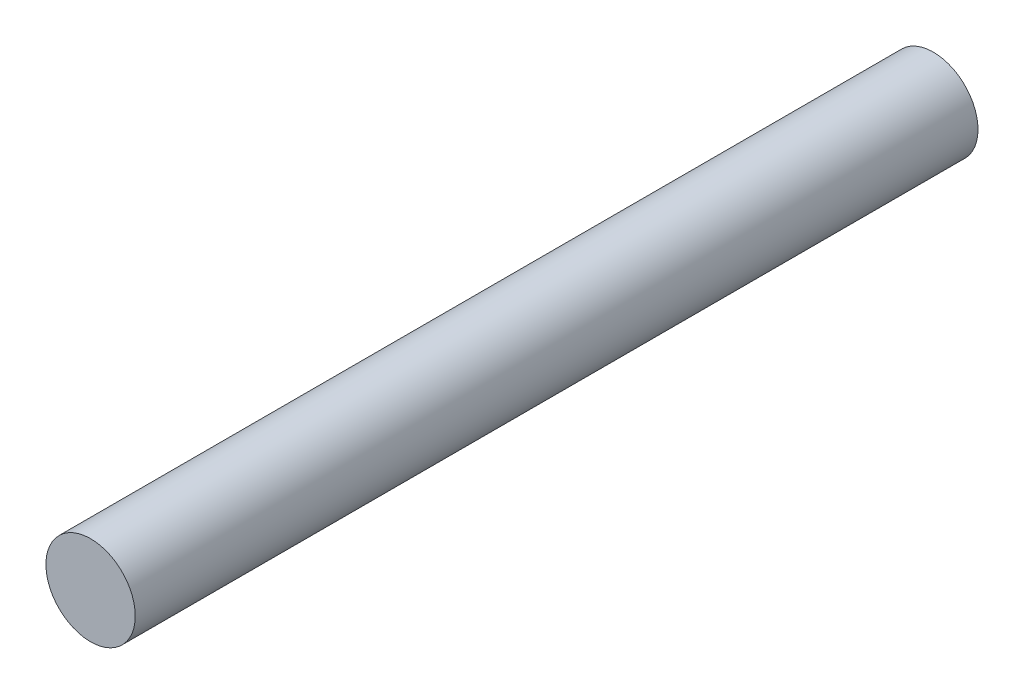
ISO-10303-21;
HEADER;
FILE_DESCRIPTION(('STEP AP214'),'2;1');
FILE_NAME('part.step','',(''),(''),'','','');
FILE_SCHEMA(('AUTOMOTIVE_DESIGN { 1 0 10303 214 1 1 1 1 }'));
ENDSEC;
DATA;
#1=APPLICATION_CONTEXT('core data for automotive mechanical design processes');
#2=APPLICATION_PROTOCOL_DEFINITION('international standard','automotive_design',2000,#1);
#3=PRODUCT_CONTEXT('',#1,'mechanical');
#4=PRODUCT('Part','Part','',(#3));
#5=PRODUCT_RELATED_PRODUCT_CATEGORY('part','',(#4));
#6=PRODUCT_DEFINITION_FORMATION('','',#4);
#7=PRODUCT_DEFINITION_CONTEXT('part definition',#1,'design');
#8=PRODUCT_DEFINITION('design','',#6,#7);
#9=PRODUCT_DEFINITION_SHAPE('','',#8);
#10=(LENGTH_UNIT() NAMED_UNIT(*) SI_UNIT(.MILLI.,.METRE.));
#11=(NAMED_UNIT(*) PLANE_ANGLE_UNIT() SI_UNIT($,.RADIAN.));
#12=(NAMED_UNIT(*) SI_UNIT($,.STERADIAN.) SOLID_ANGLE_UNIT());
#13=UNCERTAINTY_MEASURE_WITH_UNIT(LENGTH_MEASURE(1.E-05),#10,'distance_accuracy_value','');
#14=(GEOMETRIC_REPRESENTATION_CONTEXT(3) GLOBAL_UNCERTAINTY_ASSIGNED_CONTEXT((#13)) GLOBAL_UNIT_ASSIGNED_CONTEXT((#10,
#11,#12)) REPRESENTATION_CONTEXT('',''));
#15=CARTESIAN_POINT('',(0.,0.,0.));
#16=DIRECTION('',(0.,0.,1.));
#17=DIRECTION('',(1.,0.,0.));
#18=AXIS2_PLACEMENT_3D('',#15,#16,#17);
#19=CARTESIAN_POINT('',(0.,0.,300.));
#20=DIRECTION('',(0.,0.,-1.));
#21=DIRECTION('',(-1.,0.,0.));
#22=AXIS2_PLACEMENT_3D('',#19,#20,#21);
#23=CYLINDRICAL_SURFACE('',#22,15.9);
#24=CARTESIAN_POINT('',(0.,0.,300.));
#25=DIRECTION('',(0.,0.,1.));
#26=DIRECTION('',(1.,0.,0.));
#27=AXIS2_PLACEMENT_3D('',#24,#25,#26);
#28=CIRCLE('',#27,15.9);
#29=CARTESIAN_POINT('',(15.9,0.,300.));
#30=VERTEX_POINT('',#29);
#31=EDGE_CURVE('E10',#30,#30,#28,.T.);
#32=ORIENTED_EDGE('',*,*,#31,.F.);
#33=EDGE_LOOP('',(#32));
#34=FACE_BOUND('',#33,.T.);
#35=CARTESIAN_POINT('',(0.,0.,0.));
#36=DIRECTION('',(0.,0.,1.));
#37=DIRECTION('',(1.,0.,0.));
#38=AXIS2_PLACEMENT_3D('',#35,#36,#37);
#39=CIRCLE('',#38,15.9);
#40=CARTESIAN_POINT('',(15.9,0.,0.));
#41=VERTEX_POINT('',#40);
#42=EDGE_CURVE('E32',#41,#41,#39,.T.);
#43=ORIENTED_EDGE('',*,*,#42,.T.);
#44=EDGE_LOOP('',(#43));
#45=FACE_BOUND('',#44,.T.);
#46=ADVANCED_FACE('F29',(#34,#45),#23,.T.);
#47=CARTESIAN_POINT('',(0.,0.,300.));
#48=DIRECTION('',(0.,0.,1.));
#49=DIRECTION('',(1.,0.,0.));
#50=AXIS2_PLACEMENT_3D('',#47,#48,#49);
#51=PLANE('',#50);
#52=ORIENTED_EDGE('',*,*,#31,.T.);
#53=EDGE_LOOP('',(#52));
#54=FACE_BOUND('',#53,.T.);
#55=ADVANCED_FACE('F44',(#54),#51,.T.);
#56=CARTESIAN_POINT('',(0.,0.,0.));
#57=DIRECTION('',(0.,0.,1.));
#58=DIRECTION('',(1.,0.,0.));
#59=AXIS2_PLACEMENT_3D('',#56,#57,#58);
#60=PLANE('',#59);
#61=ORIENTED_EDGE('',*,*,#42,.F.);
#62=EDGE_LOOP('',(#61));
#63=FACE_BOUND('',#62,.T.);
#64=ADVANCED_FACE('F42',(#63),#60,.F.);
#65=CLOSED_SHELL('',(#46,#55,#64));
#66=MANIFOLD_SOLID_BREP('B2',#65);
#67=ADVANCED_BREP_SHAPE_REPRESENTATION('',(#18,#66),#14);
#68=SHAPE_DEFINITION_REPRESENTATION(#9,#67);
ENDSEC;
END-ISO-10303-21;
